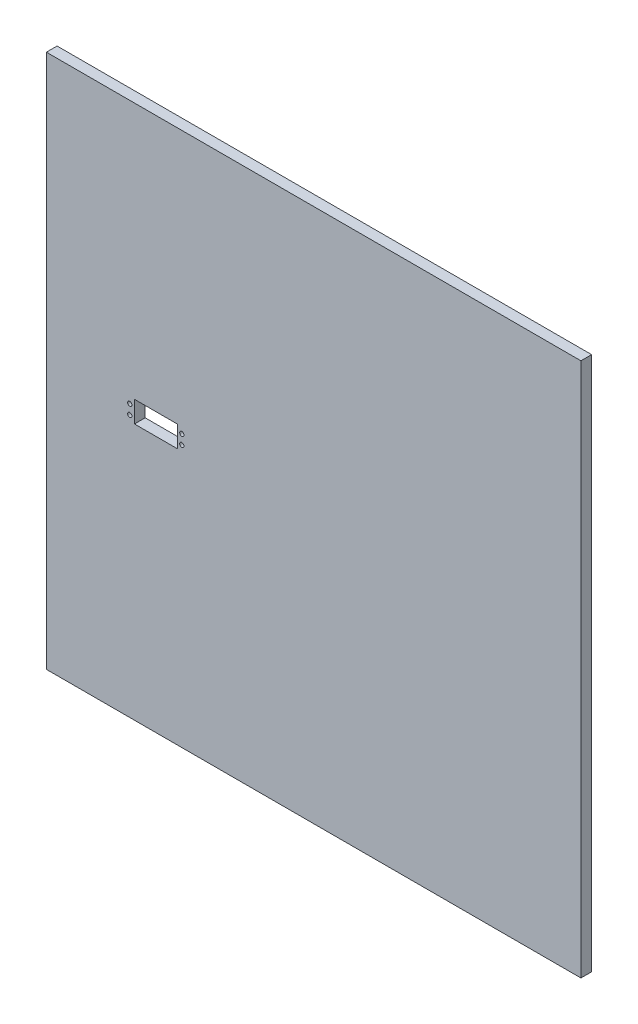
ISO-10303-21;
HEADER;
FILE_DESCRIPTION(('STEP AP214'),'2;1');
FILE_NAME('part.step','',(''),(''),'','','');
FILE_SCHEMA(('AUTOMOTIVE_DESIGN { 1 0 10303 214 1 1 1 1 }'));
ENDSEC;
DATA;
#1=APPLICATION_CONTEXT('core data for automotive mechanical design processes');
#2=APPLICATION_PROTOCOL_DEFINITION('international standard','automotive_design',2000,#1);
#3=PRODUCT_CONTEXT('',#1,'mechanical');
#4=PRODUCT('Part','Part','',(#3));
#5=PRODUCT_RELATED_PRODUCT_CATEGORY('part','',(#4));
#6=PRODUCT_DEFINITION_FORMATION('','',#4);
#7=PRODUCT_DEFINITION_CONTEXT('part definition',#1,'design');
#8=PRODUCT_DEFINITION('design','',#6,#7);
#9=PRODUCT_DEFINITION_SHAPE('','',#8);
#10=(LENGTH_UNIT() NAMED_UNIT(*) SI_UNIT(.MILLI.,.METRE.));
#11=(NAMED_UNIT(*) PLANE_ANGLE_UNIT() SI_UNIT($,.RADIAN.));
#12=(NAMED_UNIT(*) SI_UNIT($,.STERADIAN.) SOLID_ANGLE_UNIT());
#13=UNCERTAINTY_MEASURE_WITH_UNIT(LENGTH_MEASURE(1.E-05),#10,'distance_accuracy_value','');
#14=(GEOMETRIC_REPRESENTATION_CONTEXT(3) GLOBAL_UNCERTAINTY_ASSIGNED_CONTEXT((#13)) GLOBAL_UNIT_ASSIGNED_CONTEXT((#10,
#11,#12)) REPRESENTATION_CONTEXT('',''));
#15=CARTESIAN_POINT('',(0.,0.,0.));
#16=DIRECTION('',(0.,0.,1.));
#17=DIRECTION('',(1.,0.,0.));
#18=AXIS2_PLACEMENT_3D('',#15,#16,#17);
#19=CARTESIAN_POINT('',(0.,0.,10.));
#20=DIRECTION('',(0.,0.,-1.));
#21=DIRECTION('',(-1.,0.,0.));
#22=AXIS2_PLACEMENT_3D('',#19,#20,#21);
#23=PLANE('',#22);
#24=CARTESIAN_POINT('',(-123.31311732421,4.15808560549018,10.));
#25=DIRECTION('',(0.,0.,1.));
#26=DIRECTION('',(1.,0.,0.));
#27=AXIS2_PLACEMENT_3D('',#24,#25,#26);
#28=CIRCLE('',#27,2.00000000000001);
#29=CARTESIAN_POINT('',(-121.31311732421,4.15808560549018,10.));
#30=VERTEX_POINT('',#29);
#31=EDGE_CURVE('E245',#30,#30,#28,.T.);
#32=ORIENTED_EDGE('',*,*,#31,.F.);
#33=EDGE_LOOP('',(#32));
#34=FACE_BOUND('',#33,.T.);
#35=CARTESIAN_POINT('',(-172.019654713426,-4.84191439451345,10.));
#36=DIRECTION('',(0.,0.,1.));
#37=DIRECTION('',(1.,0.,0.));
#38=AXIS2_PLACEMENT_3D('',#35,#36,#37);
#39=CIRCLE('',#38,2.);
#40=CARTESIAN_POINT('',(-170.019654713426,-4.84191439451345,10.));
#41=VERTEX_POINT('',#40);
#42=EDGE_CURVE('E126',#41,#41,#39,.T.);
#43=ORIENTED_EDGE('',*,*,#42,.F.);
#44=EDGE_LOOP('',(#43));
#45=FACE_BOUND('',#44,.T.);
#46=DIRECTION('',(0.,1.,0.));
#47=VECTOR('',#46,1.);
#48=CARTESIAN_POINT('',(250.,-250.,10.));
#49=LINE('',#48,#47);
#50=CARTESIAN_POINT('',(250.,-250.,10.));
#51=VERTEX_POINT('',#50);
#52=CARTESIAN_POINT('',(250.,250.,10.));
#53=VERTEX_POINT('',#52);
#54=EDGE_CURVE('E136',#51,#53,#49,.T.);
#55=ORIENTED_EDGE('',*,*,#54,.T.);
#56=DIRECTION('',(-1.,0.,0.));
#57=VECTOR('',#56,1.);
#58=CARTESIAN_POINT('',(-250.,250.,10.));
#59=LINE('',#58,#57);
#60=CARTESIAN_POINT('',(-250.,250.,10.));
#61=VERTEX_POINT('',#60);
#62=EDGE_CURVE('E139',#53,#61,#59,.T.);
#63=ORIENTED_EDGE('',*,*,#62,.T.);
#64=DIRECTION('',(0.,-1.,0.));
#65=VECTOR('',#64,1.);
#66=CARTESIAN_POINT('',(-250.,-250.,10.));
#67=LINE('',#66,#65);
#68=CARTESIAN_POINT('',(-250.,-250.,10.));
#69=VERTEX_POINT('',#68);
#70=EDGE_CURVE('E142',#61,#69,#67,.T.);
#71=ORIENTED_EDGE('',*,*,#70,.T.);
#72=DIRECTION('',(1.,0.,0.));
#73=VECTOR('',#72,1.);
#74=CARTESIAN_POINT('',(-250.,-250.,10.));
#75=LINE('',#74,#73);
#76=EDGE_CURVE('E144',#69,#51,#75,.T.);
#77=ORIENTED_EDGE('',*,*,#76,.T.);
#78=EDGE_LOOP('',(#55,#63,#71,#77));
#79=FACE_BOUND('',#78,.T.);
#80=DIRECTION('',(0.,-1.,0.));
#81=VECTOR('',#80,1.);
#82=CARTESIAN_POINT('',(-167.599999999956,10.,10.));
#83=LINE('',#82,#81);
#84=CARTESIAN_POINT('',(-167.599999999956,10.,10.));
#85=VERTEX_POINT('',#84);
#86=CARTESIAN_POINT('',(-167.599999999956,-9.99999999999998,10.));
#87=VERTEX_POINT('',#86);
#88=EDGE_CURVE('E97',#85,#87,#83,.T.);
#89=ORIENTED_EDGE('',*,*,#88,.F.);
#90=DIRECTION('',(-1.,0.,0.));
#91=VECTOR('',#90,1.);
#92=CARTESIAN_POINT('',(-127.299999999956,10.,10.));
#93=LINE('',#92,#91);
#94=CARTESIAN_POINT('',(-127.299999999956,10.,10.));
#95=VERTEX_POINT('',#94);
#96=EDGE_CURVE('E120',#95,#85,#93,.T.);
#97=ORIENTED_EDGE('',*,*,#96,.F.);
#98=DIRECTION('',(0.,1.,0.));
#99=VECTOR('',#98,1.);
#100=CARTESIAN_POINT('',(-127.299999999956,10.,10.));
#101=LINE('',#100,#99);
#102=CARTESIAN_POINT('',(-127.299999999956,-9.99999999999998,10.));
#103=VERTEX_POINT('',#102);
#104=EDGE_CURVE('E118',#103,#95,#101,.T.);
#105=ORIENTED_EDGE('',*,*,#104,.F.);
#106=DIRECTION('',(1.,0.,0.));
#107=VECTOR('',#106,1.);
#108=CARTESIAN_POINT('',(-127.299999999956,-9.99999999999998,10.));
#109=LINE('',#108,#107);
#110=EDGE_CURVE('E105',#87,#103,#109,.T.);
#111=ORIENTED_EDGE('',*,*,#110,.F.);
#112=EDGE_LOOP('',(#89,#97,#105,#111));
#113=FACE_BOUND('',#112,.T.);
#114=CARTESIAN_POINT('',(-172.019654713426,4.15808560548655,10.));
#115=DIRECTION('',(0.,0.,1.));
#116=DIRECTION('',(1.,0.,0.));
#117=AXIS2_PLACEMENT_3D('',#114,#115,#116);
#118=CIRCLE('',#117,1.99999999999997);
#119=CARTESIAN_POINT('',(-170.019654713426,4.15808560548655,10.));
#120=VERTEX_POINT('',#119);
#121=EDGE_CURVE('E251',#120,#120,#118,.T.);
#122=ORIENTED_EDGE('',*,*,#121,.F.);
#123=EDGE_LOOP('',(#122));
#124=FACE_BOUND('',#123,.T.);
#125=CARTESIAN_POINT('',(-123.313117324209,-4.84191439450982,10.));
#126=DIRECTION('',(0.,0.,1.));
#127=DIRECTION('',(1.,0.,0.));
#128=AXIS2_PLACEMENT_3D('',#125,#126,#127);
#129=CIRCLE('',#128,2.00000000000002);
#130=CARTESIAN_POINT('',(-121.313117324209,-4.84191439450982,10.));
#131=VERTEX_POINT('',#130);
#132=EDGE_CURVE('E236',#131,#131,#129,.T.);
#133=ORIENTED_EDGE('',*,*,#132,.F.);
#134=EDGE_LOOP('',(#133));
#135=FACE_BOUND('',#134,.T.);
#136=ADVANCED_FACE('F32',(#34,#45,#79,#113,#124,#135),#23,.F.);
#137=CARTESIAN_POINT('',(0.,0.,0.));
#138=DIRECTION('',(0.,0.,-1.));
#139=DIRECTION('',(-1.,0.,0.));
#140=AXIS2_PLACEMENT_3D('',#137,#138,#139);
#141=PLANE('',#140);
#142=CARTESIAN_POINT('',(-123.31311732421,4.15808560549018,0.));
#143=DIRECTION('',(0.,0.,1.));
#144=DIRECTION('',(1.,0.,0.));
#145=AXIS2_PLACEMENT_3D('',#142,#143,#144);
#146=CIRCLE('',#145,2.00000000000001);
#147=CARTESIAN_POINT('',(-121.31311732421,4.15808560549018,0.));
#148=VERTEX_POINT('',#147);
#149=EDGE_CURVE('E242',#148,#148,#146,.T.);
#150=ORIENTED_EDGE('',*,*,#149,.T.);
#151=EDGE_LOOP('',(#150));
#152=FACE_BOUND('',#151,.T.);
#153=CARTESIAN_POINT('',(-172.019654713426,-4.84191439451345,0.));
#154=DIRECTION('',(0.,0.,1.));
#155=DIRECTION('',(1.,0.,0.));
#156=AXIS2_PLACEMENT_3D('',#153,#154,#155);
#157=CIRCLE('',#156,2.);
#158=CARTESIAN_POINT('',(-170.019654713426,-4.84191439451345,0.));
#159=VERTEX_POINT('',#158);
#160=EDGE_CURVE('E254',#159,#159,#157,.T.);
#161=ORIENTED_EDGE('',*,*,#160,.T.);
#162=EDGE_LOOP('',(#161));
#163=FACE_BOUND('',#162,.T.);
#164=DIRECTION('',(0.,1.,0.));
#165=VECTOR('',#164,1.);
#166=CARTESIAN_POINT('',(250.,-250.,0.));
#167=LINE('',#166,#165);
#168=CARTESIAN_POINT('',(250.,-250.,0.));
#169=VERTEX_POINT('',#168);
#170=CARTESIAN_POINT('',(250.,250.,0.));
#171=VERTEX_POINT('',#170);
#172=EDGE_CURVE('E113',#169,#171,#167,.T.);
#173=ORIENTED_EDGE('',*,*,#172,.F.);
#174=DIRECTION('',(1.,0.,0.));
#175=VECTOR('',#174,1.);
#176=CARTESIAN_POINT('',(-250.,-250.,0.));
#177=LINE('',#176,#175);
#178=CARTESIAN_POINT('',(-250.,-250.,0.));
#179=VERTEX_POINT('',#178);
#180=EDGE_CURVE('E140',#179,#169,#177,.T.);
#181=ORIENTED_EDGE('',*,*,#180,.F.);
#182=DIRECTION('',(0.,-1.,0.));
#183=VECTOR('',#182,1.);
#184=CARTESIAN_POINT('',(-250.,-250.,0.));
#185=LINE('',#184,#183);
#186=CARTESIAN_POINT('',(-250.,250.,0.));
#187=VERTEX_POINT('',#186);
#188=EDGE_CURVE('E151',#187,#179,#185,.T.);
#189=ORIENTED_EDGE('',*,*,#188,.F.);
#190=DIRECTION('',(-1.,0.,0.));
#191=VECTOR('',#190,1.);
#192=CARTESIAN_POINT('',(-250.,250.,0.));
#193=LINE('',#192,#191);
#194=EDGE_CURVE('E149',#171,#187,#193,.T.);
#195=ORIENTED_EDGE('',*,*,#194,.F.);
#196=EDGE_LOOP('',(#173,#181,#189,#195));
#197=FACE_BOUND('',#196,.T.);
#198=DIRECTION('',(-1.,0.,0.));
#199=VECTOR('',#198,1.);
#200=CARTESIAN_POINT('',(-127.299999999956,10.,0.));
#201=LINE('',#200,#199);
#202=CARTESIAN_POINT('',(-127.299999999956,10.,0.));
#203=VERTEX_POINT('',#202);
#204=CARTESIAN_POINT('',(-167.599999999956,10.,0.));
#205=VERTEX_POINT('',#204);
#206=EDGE_CURVE('E106',#203,#205,#201,.T.);
#207=ORIENTED_EDGE('',*,*,#206,.T.);
#208=DIRECTION('',(0.,-1.,0.));
#209=VECTOR('',#208,1.);
#210=CARTESIAN_POINT('',(-167.599999999956,10.,0.));
#211=LINE('',#210,#209);
#212=CARTESIAN_POINT('',(-167.599999999956,-9.99999999999998,0.));
#213=VERTEX_POINT('',#212);
#214=EDGE_CURVE('E55',#205,#213,#211,.T.);
#215=ORIENTED_EDGE('',*,*,#214,.T.);
#216=DIRECTION('',(1.,0.,0.));
#217=VECTOR('',#216,1.);
#218=CARTESIAN_POINT('',(-127.299999999956,-9.99999999999998,0.));
#219=LINE('',#218,#217);
#220=CARTESIAN_POINT('',(-127.299999999956,-9.99999999999998,0.));
#221=VERTEX_POINT('',#220);
#222=EDGE_CURVE('E112',#213,#221,#219,.T.);
#223=ORIENTED_EDGE('',*,*,#222,.T.);
#224=DIRECTION('',(0.,1.,0.));
#225=VECTOR('',#224,1.);
#226=CARTESIAN_POINT('',(-127.299999999956,10.,0.));
#227=LINE('',#226,#225);
#228=EDGE_CURVE('E128',#221,#203,#227,.T.);
#229=ORIENTED_EDGE('',*,*,#228,.T.);
#230=EDGE_LOOP('',(#207,#215,#223,#229));
#231=FACE_BOUND('',#230,.T.);
#232=CARTESIAN_POINT('',(-172.019654713426,4.15808560548655,0.));
#233=DIRECTION('',(0.,0.,1.));
#234=DIRECTION('',(1.,0.,0.));
#235=AXIS2_PLACEMENT_3D('',#232,#233,#234);
#236=CIRCLE('',#235,1.99999999999997);
#237=CARTESIAN_POINT('',(-170.019654713426,4.15808560548655,0.));
#238=VERTEX_POINT('',#237);
#239=EDGE_CURVE('E248',#238,#238,#236,.T.);
#240=ORIENTED_EDGE('',*,*,#239,.T.);
#241=EDGE_LOOP('',(#240));
#242=FACE_BOUND('',#241,.T.);
#243=CARTESIAN_POINT('',(-123.313117324209,-4.84191439450982,0.));
#244=DIRECTION('',(0.,0.,1.));
#245=DIRECTION('',(1.,0.,0.));
#246=AXIS2_PLACEMENT_3D('',#243,#244,#245);
#247=CIRCLE('',#246,2.00000000000002);
#248=CARTESIAN_POINT('',(-121.313117324209,-4.84191439450982,0.));
#249=VERTEX_POINT('',#248);
#250=EDGE_CURVE('E239',#249,#249,#247,.T.);
#251=ORIENTED_EDGE('',*,*,#250,.T.);
#252=EDGE_LOOP('',(#251));
#253=FACE_BOUND('',#252,.T.);
#254=ADVANCED_FACE('F169',(#152,#163,#197,#231,#242,#253),#141,.T.);
#255=CARTESIAN_POINT('',(250.,-250.,10.));
#256=DIRECTION('',(-1.,0.,0.));
#257=DIRECTION('',(0.,0.,1.));
#258=AXIS2_PLACEMENT_3D('',#255,#256,#257);
#259=PLANE('',#258);
#260=ORIENTED_EDGE('',*,*,#172,.T.);
#261=DIRECTION('',(0.,0.,-1.));
#262=VECTOR('',#261,1.);
#263=CARTESIAN_POINT('',(250.,250.,10.));
#264=LINE('',#263,#262);
#265=EDGE_CURVE('E11',#53,#171,#264,.T.);
#266=ORIENTED_EDGE('',*,*,#265,.F.);
#267=ORIENTED_EDGE('',*,*,#54,.F.);
#268=DIRECTION('',(0.,0.,-1.));
#269=VECTOR('',#268,1.);
#270=CARTESIAN_POINT('',(250.,-250.,10.));
#271=LINE('',#270,#269);
#272=EDGE_CURVE('E146',#51,#169,#271,.T.);
#273=ORIENTED_EDGE('',*,*,#272,.T.);
#274=EDGE_LOOP('',(#260,#266,#267,#273));
#275=FACE_BOUND('',#274,.T.);
#276=ADVANCED_FACE('F34',(#275),#259,.F.);
#277=CARTESIAN_POINT('',(-250.,250.,10.));
#278=DIRECTION('',(0.,-1.,0.));
#279=DIRECTION('',(0.,0.,-1.));
#280=AXIS2_PLACEMENT_3D('',#277,#278,#279);
#281=PLANE('',#280);
#282=ORIENTED_EDGE('',*,*,#194,.T.);
#283=DIRECTION('',(0.,0.,-1.));
#284=VECTOR('',#283,1.);
#285=CARTESIAN_POINT('',(-250.,250.,10.));
#286=LINE('',#285,#284);
#287=EDGE_CURVE('E40',#61,#187,#286,.T.);
#288=ORIENTED_EDGE('',*,*,#287,.F.);
#289=ORIENTED_EDGE('',*,*,#62,.F.);
#290=ORIENTED_EDGE('',*,*,#265,.T.);
#291=EDGE_LOOP('',(#282,#288,#289,#290));
#292=FACE_BOUND('',#291,.T.);
#293=ADVANCED_FACE('F179',(#292),#281,.F.);
#294=CARTESIAN_POINT('',(-250.,-250.,10.));
#295=DIRECTION('',(1.,0.,0.));
#296=DIRECTION('',(0.,0.,-1.));
#297=AXIS2_PLACEMENT_3D('',#294,#295,#296);
#298=PLANE('',#297);
#299=ORIENTED_EDGE('',*,*,#188,.T.);
#300=DIRECTION('',(0.,0.,-1.));
#301=VECTOR('',#300,1.);
#302=CARTESIAN_POINT('',(-250.,-250.,10.));
#303=LINE('',#302,#301);
#304=EDGE_CURVE('E156',#69,#179,#303,.T.);
#305=ORIENTED_EDGE('',*,*,#304,.F.);
#306=ORIENTED_EDGE('',*,*,#70,.F.);
#307=ORIENTED_EDGE('',*,*,#287,.T.);
#308=EDGE_LOOP('',(#299,#305,#306,#307));
#309=FACE_BOUND('',#308,.T.);
#310=ADVANCED_FACE('F163',(#309),#298,.F.);
#311=CARTESIAN_POINT('',(-250.,-250.,10.));
#312=DIRECTION('',(0.,1.,0.));
#313=DIRECTION('',(0.,0.,1.));
#314=AXIS2_PLACEMENT_3D('',#311,#312,#313);
#315=PLANE('',#314);
#316=ORIENTED_EDGE('',*,*,#180,.T.);
#317=ORIENTED_EDGE('',*,*,#272,.F.);
#318=ORIENTED_EDGE('',*,*,#76,.F.);
#319=ORIENTED_EDGE('',*,*,#304,.T.);
#320=EDGE_LOOP('',(#316,#317,#318,#319));
#321=FACE_BOUND('',#320,.T.);
#322=ADVANCED_FACE('F173',(#321),#315,.F.);
#323=CARTESIAN_POINT('',(-167.599999999956,10.,10.));
#324=DIRECTION('',(1.,0.,0.));
#325=DIRECTION('',(0.,0.,-1.));
#326=AXIS2_PLACEMENT_3D('',#323,#324,#325);
#327=PLANE('',#326);
#328=ORIENTED_EDGE('',*,*,#214,.F.);
#329=DIRECTION('',(0.,0.,-1.));
#330=VECTOR('',#329,1.);
#331=CARTESIAN_POINT('',(-167.599999999956,10.,10.));
#332=LINE('',#331,#330);
#333=EDGE_CURVE('E101',#85,#205,#332,.T.);
#334=ORIENTED_EDGE('',*,*,#333,.F.);
#335=ORIENTED_EDGE('',*,*,#88,.T.);
#336=DIRECTION('',(0.,0.,-1.));
#337=VECTOR('',#336,1.);
#338=CARTESIAN_POINT('',(-167.599999999956,-9.99999999999998,10.));
#339=LINE('',#338,#337);
#340=EDGE_CURVE('E100',#87,#213,#339,.T.);
#341=ORIENTED_EDGE('',*,*,#340,.T.);
#342=EDGE_LOOP('',(#328,#334,#335,#341));
#343=FACE_BOUND('',#342,.T.);
#344=ADVANCED_FACE('F99',(#343),#327,.T.);
#345=CARTESIAN_POINT('',(-127.299999999956,-9.99999999999998,10.));
#346=DIRECTION('',(0.,1.,0.));
#347=DIRECTION('',(-1.,0.,0.));
#348=AXIS2_PLACEMENT_3D('',#345,#346,#347);
#349=PLANE('',#348);
#350=ORIENTED_EDGE('',*,*,#222,.F.);
#351=ORIENTED_EDGE('',*,*,#340,.F.);
#352=ORIENTED_EDGE('',*,*,#110,.T.);
#353=DIRECTION('',(0.,0.,-1.));
#354=VECTOR('',#353,1.);
#355=CARTESIAN_POINT('',(-127.299999999956,-9.99999999999998,10.));
#356=LINE('',#355,#354);
#357=EDGE_CURVE('E114',#103,#221,#356,.T.);
#358=ORIENTED_EDGE('',*,*,#357,.T.);
#359=EDGE_LOOP('',(#350,#351,#352,#358));
#360=FACE_BOUND('',#359,.T.);
#361=ADVANCED_FACE('F109',(#360),#349,.T.);
#362=CARTESIAN_POINT('',(-127.299999999956,10.,10.));
#363=DIRECTION('',(-1.,0.,0.));
#364=DIRECTION('',(0.,0.,1.));
#365=AXIS2_PLACEMENT_3D('',#362,#363,#364);
#366=PLANE('',#365);
#367=ORIENTED_EDGE('',*,*,#228,.F.);
#368=ORIENTED_EDGE('',*,*,#357,.F.);
#369=ORIENTED_EDGE('',*,*,#104,.T.);
#370=DIRECTION('',(0.,0.,-1.));
#371=VECTOR('',#370,1.);
#372=CARTESIAN_POINT('',(-127.299999999956,10.,10.));
#373=LINE('',#372,#371);
#374=EDGE_CURVE('E47',#95,#203,#373,.T.);
#375=ORIENTED_EDGE('',*,*,#374,.T.);
#376=EDGE_LOOP('',(#367,#368,#369,#375));
#377=FACE_BOUND('',#376,.T.);
#378=ADVANCED_FACE('F206',(#377),#366,.T.);
#379=CARTESIAN_POINT('',(-127.299999999956,10.,10.));
#380=DIRECTION('',(0.,-1.,0.));
#381=DIRECTION('',(1.,0.,0.));
#382=AXIS2_PLACEMENT_3D('',#379,#380,#381);
#383=PLANE('',#382);
#384=ORIENTED_EDGE('',*,*,#206,.F.);
#385=ORIENTED_EDGE('',*,*,#374,.F.);
#386=ORIENTED_EDGE('',*,*,#96,.T.);
#387=ORIENTED_EDGE('',*,*,#333,.T.);
#388=EDGE_LOOP('',(#384,#385,#386,#387));
#389=FACE_BOUND('',#388,.T.);
#390=ADVANCED_FACE('F210',(#389),#383,.T.);
#391=CARTESIAN_POINT('',(-172.019654713426,-4.84191439451345,10.));
#392=DIRECTION('',(0.,0.,-1.));
#393=DIRECTION('',(-1.,0.,0.));
#394=AXIS2_PLACEMENT_3D('',#391,#392,#393);
#395=CYLINDRICAL_SURFACE('',#394,2.);
#396=ORIENTED_EDGE('',*,*,#42,.T.);
#397=EDGE_LOOP('',(#396));
#398=FACE_BOUND('',#397,.T.);
#399=ORIENTED_EDGE('',*,*,#160,.F.);
#400=EDGE_LOOP('',(#399));
#401=FACE_BOUND('',#400,.T.);
#402=ADVANCED_FACE('F216',(#398,#401),#395,.F.);
#403=CARTESIAN_POINT('',(-172.019654713426,4.15808560548655,10.));
#404=DIRECTION('',(0.,0.,-1.));
#405=DIRECTION('',(-1.,0.,0.));
#406=AXIS2_PLACEMENT_3D('',#403,#404,#405);
#407=CYLINDRICAL_SURFACE('',#406,1.99999999999997);
#408=ORIENTED_EDGE('',*,*,#121,.T.);
#409=EDGE_LOOP('',(#408));
#410=FACE_BOUND('',#409,.T.);
#411=ORIENTED_EDGE('',*,*,#239,.F.);
#412=EDGE_LOOP('',(#411));
#413=FACE_BOUND('',#412,.T.);
#414=ADVANCED_FACE('F219',(#410,#413),#407,.F.);
#415=CARTESIAN_POINT('',(-123.31311732421,4.15808560549018,10.));
#416=DIRECTION('',(0.,0.,-1.));
#417=DIRECTION('',(-1.,0.,0.));
#418=AXIS2_PLACEMENT_3D('',#415,#416,#417);
#419=CYLINDRICAL_SURFACE('',#418,2.00000000000001);
#420=ORIENTED_EDGE('',*,*,#31,.T.);
#421=EDGE_LOOP('',(#420));
#422=FACE_BOUND('',#421,.T.);
#423=ORIENTED_EDGE('',*,*,#149,.F.);
#424=EDGE_LOOP('',(#423));
#425=FACE_BOUND('',#424,.T.);
#426=ADVANCED_FACE('F223',(#422,#425),#419,.F.);
#427=CARTESIAN_POINT('',(-123.313117324209,-4.84191439450982,10.));
#428=DIRECTION('',(0.,0.,-1.));
#429=DIRECTION('',(-1.,0.,0.));
#430=AXIS2_PLACEMENT_3D('',#427,#428,#429);
#431=CYLINDRICAL_SURFACE('',#430,2.00000000000002);
#432=ORIENTED_EDGE('',*,*,#132,.T.);
#433=EDGE_LOOP('',(#432));
#434=FACE_BOUND('',#433,.T.);
#435=ORIENTED_EDGE('',*,*,#250,.F.);
#436=EDGE_LOOP('',(#435));
#437=FACE_BOUND('',#436,.T.);
#438=ADVANCED_FACE('F227',(#434,#437),#431,.F.);
#439=CLOSED_SHELL('',(#136,#254,#276,#293,#310,#322,#344,#361,#378,#390,#402,#414,#426,#438));
#440=MANIFOLD_SOLID_BREP('B2',#439);
#441=ADVANCED_BREP_SHAPE_REPRESENTATION('',(#18,#440),#14);
#442=SHAPE_DEFINITION_REPRESENTATION(#9,#441);
ENDSEC;
END-ISO-10303-21;
